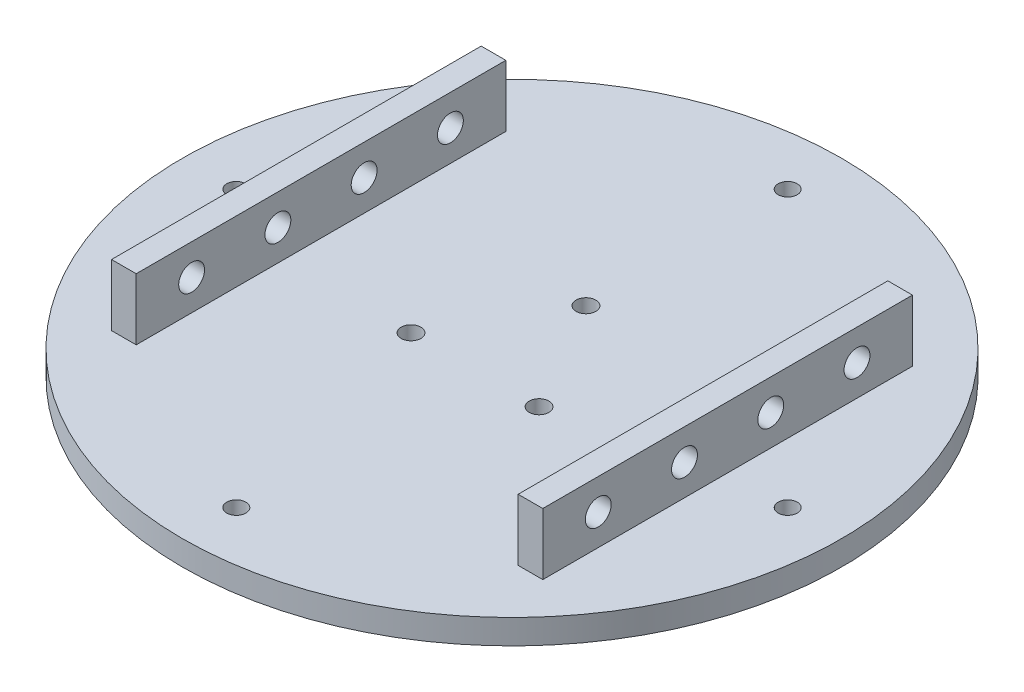
ISO-10303-21;
HEADER;
FILE_DESCRIPTION(('STEP AP214'),'2;1');
FILE_NAME('part.step','',(''),(''),'','','');
FILE_SCHEMA(('AUTOMOTIVE_DESIGN { 1 0 10303 214 1 1 1 1 }'));
ENDSEC;
DATA;
#1=APPLICATION_CONTEXT('core data for automotive mechanical design processes');
#2=APPLICATION_PROTOCOL_DEFINITION('international standard','automotive_design',2000,#1);
#3=PRODUCT_CONTEXT('',#1,'mechanical');
#4=PRODUCT('Part','Part','',(#3));
#5=PRODUCT_RELATED_PRODUCT_CATEGORY('part','',(#4));
#6=PRODUCT_DEFINITION_FORMATION('','',#4);
#7=PRODUCT_DEFINITION_CONTEXT('part definition',#1,'design');
#8=PRODUCT_DEFINITION('design','',#6,#7);
#9=PRODUCT_DEFINITION_SHAPE('','',#8);
#10=(LENGTH_UNIT() NAMED_UNIT(*) SI_UNIT(.MILLI.,.METRE.));
#11=(NAMED_UNIT(*) PLANE_ANGLE_UNIT() SI_UNIT($,.RADIAN.));
#12=(NAMED_UNIT(*) SI_UNIT($,.STERADIAN.) SOLID_ANGLE_UNIT());
#13=UNCERTAINTY_MEASURE_WITH_UNIT(LENGTH_MEASURE(1.E-05),#10,'distance_accuracy_value','');
#14=(GEOMETRIC_REPRESENTATION_CONTEXT(3) GLOBAL_UNCERTAINTY_ASSIGNED_CONTEXT((#13)) GLOBAL_UNIT_ASSIGNED_CONTEXT((#10,
#11,#12)) REPRESENTATION_CONTEXT('',''));
#15=CARTESIAN_POINT('',(0.,0.,0.));
#16=DIRECTION('',(0.,0.,1.));
#17=DIRECTION('',(1.,0.,0.));
#18=AXIS2_PLACEMENT_3D('',#15,#16,#17);
#19=CARTESIAN_POINT('',(0.,4.,0.));
#20=DIRECTION('',(0.,1.,0.));
#21=DIRECTION('',(0.,0.,1.));
#22=AXIS2_PLACEMENT_3D('',#19,#20,#21);
#23=PLANE('',#22);
#24=CARTESIAN_POINT('',(10.3923048454133,4.,5.99999999999997));
#25=DIRECTION('',(0.,1.,0.));
#26=DIRECTION('',(0.,0.,1.));
#27=AXIS2_PLACEMENT_3D('',#24,#25,#26);
#28=CIRCLE('',#27,1.6);
#29=CARTESIAN_POINT('',(10.3923048454133,4.,7.59999999999998));
#30=VERTEX_POINT('',#29);
#31=EDGE_CURVE('E166',#30,#30,#28,.T.);
#32=ORIENTED_EDGE('',*,*,#31,.F.);
#33=EDGE_LOOP('',(#32));
#34=FACE_BOUND('',#33,.T.);
#35=CARTESIAN_POINT('',(0.,4.,44.75));
#36=DIRECTION('',(0.,1.,0.));
#37=DIRECTION('',(0.,0.,-1.));
#38=AXIS2_PLACEMENT_3D('',#35,#36,#37);
#39=CIRCLE('',#38,1.55);
#40=CARTESIAN_POINT('',(0.,4.,43.2));
#41=VERTEX_POINT('',#40);
#42=EDGE_CURVE('E178',#41,#41,#39,.T.);
#43=ORIENTED_EDGE('',*,*,#42,.F.);
#44=EDGE_LOOP('',(#43));
#45=FACE_BOUND('',#44,.T.);
#46=CARTESIAN_POINT('',(-44.75,4.,0.));
#47=DIRECTION('',(0.,1.,0.));
#48=DIRECTION('',(0.,0.,1.));
#49=AXIS2_PLACEMENT_3D('',#46,#47,#48);
#50=CIRCLE('',#49,1.55);
#51=CARTESIAN_POINT('',(-44.75,4.,1.55));
#52=VERTEX_POINT('',#51);
#53=EDGE_CURVE('E190',#52,#52,#50,.T.);
#54=ORIENTED_EDGE('',*,*,#53,.F.);
#55=EDGE_LOOP('',(#54));
#56=FACE_BOUND('',#55,.T.);
#57=CARTESIAN_POINT('',(0.,4.,0.));
#58=DIRECTION('',(0.,1.,0.));
#59=DIRECTION('',(0.,0.,1.));
#60=AXIS2_PLACEMENT_3D('',#57,#58,#59);
#61=CIRCLE('',#60,53.4919308927614);
#62=CARTESIAN_POINT('',(0.,4.,53.4919308927614));
#63=VERTEX_POINT('',#62);
#64=EDGE_CURVE('E11',#63,#63,#61,.T.);
#65=ORIENTED_EDGE('',*,*,#64,.T.);
#66=EDGE_LOOP('',(#65));
#67=FACE_BOUND('',#66,.T.);
#68=CARTESIAN_POINT('',(0.,4.,-44.75));
#69=DIRECTION('',(0.,1.,0.));
#70=DIRECTION('',(0.,0.,1.));
#71=AXIS2_PLACEMENT_3D('',#68,#69,#70);
#72=CIRCLE('',#71,1.55);
#73=CARTESIAN_POINT('',(0.,4.,-43.2));
#74=VERTEX_POINT('',#73);
#75=EDGE_CURVE('E196',#74,#74,#72,.T.);
#76=ORIENTED_EDGE('',*,*,#75,.F.);
#77=EDGE_LOOP('',(#76));
#78=FACE_BOUND('',#77,.T.);
#79=CARTESIAN_POINT('',(44.75,4.,0.));
#80=DIRECTION('',(0.,1.,0.));
#81=DIRECTION('',(0.,0.,-1.));
#82=AXIS2_PLACEMENT_3D('',#79,#80,#81);
#83=CIRCLE('',#82,1.55);
#84=CARTESIAN_POINT('',(44.75,4.,-1.55));
#85=VERTEX_POINT('',#84);
#86=EDGE_CURVE('E184',#85,#85,#83,.T.);
#87=ORIENTED_EDGE('',*,*,#86,.F.);
#88=EDGE_LOOP('',(#87));
#89=FACE_BOUND('',#88,.T.);
#90=CARTESIAN_POINT('',(0.,4.,-12.));
#91=DIRECTION('',(0.,1.,0.));
#92=DIRECTION('',(0.,0.,1.));
#93=AXIS2_PLACEMENT_3D('',#90,#91,#92);
#94=CIRCLE('',#93,1.6);
#95=CARTESIAN_POINT('',(0.,4.,-10.4));
#96=VERTEX_POINT('',#95);
#97=EDGE_CURVE('E172',#96,#96,#94,.T.);
#98=ORIENTED_EDGE('',*,*,#97,.F.);
#99=EDGE_LOOP('',(#98));
#100=FACE_BOUND('',#99,.T.);
#101=CARTESIAN_POINT('',(-10.3923048454133,4.,5.99999999999998));
#102=DIRECTION('',(0.,1.,0.));
#103=DIRECTION('',(0.,0.,1.));
#104=AXIS2_PLACEMENT_3D('',#101,#102,#103);
#105=CIRCLE('',#104,1.6);
#106=CARTESIAN_POINT('',(-10.3923048454133,4.,7.59999999999998));
#107=VERTEX_POINT('',#106);
#108=EDGE_CURVE('E160',#107,#107,#105,.T.);
#109=ORIENTED_EDGE('',*,*,#108,.F.);
#110=EDGE_LOOP('',(#109));
#111=FACE_BOUND('',#110,.T.);
#112=DIRECTION('',(1.,0.,0.));
#113=VECTOR('',#112,1.);
#114=CARTESIAN_POINT('',(-35.,4.,30.));
#115=LINE('',#114,#113);
#116=CARTESIAN_POINT('',(-35.,4.,30.));
#117=VERTEX_POINT('',#116);
#118=CARTESIAN_POINT('',(-31.,4.,30.));
#119=VERTEX_POINT('',#118);
#120=EDGE_CURVE('E131',#117,#119,#115,.T.);
#121=ORIENTED_EDGE('',*,*,#120,.F.);
#122=DIRECTION('',(0.,0.,1.));
#123=VECTOR('',#122,1.);
#124=CARTESIAN_POINT('',(-35.,4.,-30.));
#125=LINE('',#124,#123);
#126=CARTESIAN_POINT('',(-35.,4.,-30.));
#127=VERTEX_POINT('',#126);
#128=EDGE_CURVE('E128',#127,#117,#125,.T.);
#129=ORIENTED_EDGE('',*,*,#128,.F.);
#130=DIRECTION('',(-1.,0.,0.));
#131=VECTOR('',#130,1.);
#132=CARTESIAN_POINT('',(-35.,4.,-30.));
#133=LINE('',#132,#131);
#134=CARTESIAN_POINT('',(-31.,4.,-30.));
#135=VERTEX_POINT('',#134);
#136=EDGE_CURVE('E140',#135,#127,#133,.T.);
#137=ORIENTED_EDGE('',*,*,#136,.F.);
#138=DIRECTION('',(0.,0.,-1.));
#139=VECTOR('',#138,1.);
#140=CARTESIAN_POINT('',(-31.,4.,-30.));
#141=LINE('',#140,#139);
#142=EDGE_CURVE('E148',#119,#135,#141,.T.);
#143=ORIENTED_EDGE('',*,*,#142,.F.);
#144=EDGE_LOOP('',(#121,#129,#137,#143));
#145=FACE_BOUND('',#144,.T.);
#146=DIRECTION('',(-1.,0.,0.));
#147=VECTOR('',#146,1.);
#148=CARTESIAN_POINT('',(35.,4.,-30.));
#149=LINE('',#148,#147);
#150=CARTESIAN_POINT('',(35.,4.,-30.));
#151=VERTEX_POINT('',#150);
#152=CARTESIAN_POINT('',(31.,4.,-30.));
#153=VERTEX_POINT('',#152);
#154=EDGE_CURVE('E248',#151,#153,#149,.T.);
#155=ORIENTED_EDGE('',*,*,#154,.F.);
#156=DIRECTION('',(0.,0.,-1.));
#157=VECTOR('',#156,1.);
#158=CARTESIAN_POINT('',(35.,4.,-30.));
#159=LINE('',#158,#157);
#160=CARTESIAN_POINT('',(35.,4.,30.));
#161=VERTEX_POINT('',#160);
#162=EDGE_CURVE('E126',#161,#151,#159,.T.);
#163=ORIENTED_EDGE('',*,*,#162,.F.);
#164=DIRECTION('',(1.,0.,0.));
#165=VECTOR('',#164,1.);
#166=CARTESIAN_POINT('',(35.,4.,30.));
#167=LINE('',#166,#165);
#168=CARTESIAN_POINT('',(31.,4.,30.));
#169=VERTEX_POINT('',#168);
#170=EDGE_CURVE('E122',#169,#161,#167,.T.);
#171=ORIENTED_EDGE('',*,*,#170,.F.);
#172=DIRECTION('',(0.,0.,1.));
#173=VECTOR('',#172,1.);
#174=CARTESIAN_POINT('',(31.,4.,-30.));
#175=LINE('',#174,#173);
#176=EDGE_CURVE('E250',#153,#169,#175,.T.);
#177=ORIENTED_EDGE('',*,*,#176,.F.);
#178=EDGE_LOOP('',(#155,#163,#171,#177));
#179=FACE_BOUND('',#178,.T.);
#180=ADVANCED_FACE('F35',(#34,#45,#56,#67,#78,#89,#100,#111,#145,#179),#23,.T.);
#181=CARTESIAN_POINT('',(0.,0.,0.));
#182=DIRECTION('',(0.,1.,0.));
#183=DIRECTION('',(0.,0.,1.));
#184=AXIS2_PLACEMENT_3D('',#181,#182,#183);
#185=PLANE('',#184);
#186=CARTESIAN_POINT('',(0.,0.,0.));
#187=DIRECTION('',(0.,1.,0.));
#188=DIRECTION('',(0.,0.,1.));
#189=AXIS2_PLACEMENT_3D('',#186,#187,#188);
#190=CIRCLE('',#189,53.4919308927614);
#191=CARTESIAN_POINT('',(0.,0.,53.4919308927614));
#192=VERTEX_POINT('',#191);
#193=EDGE_CURVE('E44',#192,#192,#190,.T.);
#194=ORIENTED_EDGE('',*,*,#193,.F.);
#195=EDGE_LOOP('',(#194));
#196=FACE_BOUND('',#195,.T.);
#197=CARTESIAN_POINT('',(0.,0.,-44.75));
#198=DIRECTION('',(0.,1.,0.));
#199=DIRECTION('',(0.,0.,1.));
#200=AXIS2_PLACEMENT_3D('',#197,#198,#199);
#201=CIRCLE('',#200,1.55);
#202=CARTESIAN_POINT('',(0.,0.,-43.2));
#203=VERTEX_POINT('',#202);
#204=EDGE_CURVE('E193',#203,#203,#201,.T.);
#205=ORIENTED_EDGE('',*,*,#204,.T.);
#206=EDGE_LOOP('',(#205));
#207=FACE_BOUND('',#206,.T.);
#208=CARTESIAN_POINT('',(-44.75,0.,0.));
#209=DIRECTION('',(0.,1.,0.));
#210=DIRECTION('',(0.,0.,1.));
#211=AXIS2_PLACEMENT_3D('',#208,#209,#210);
#212=CIRCLE('',#211,1.55);
#213=CARTESIAN_POINT('',(-44.75,0.,1.55));
#214=VERTEX_POINT('',#213);
#215=EDGE_CURVE('E187',#214,#214,#212,.T.);
#216=ORIENTED_EDGE('',*,*,#215,.T.);
#217=EDGE_LOOP('',(#216));
#218=FACE_BOUND('',#217,.T.);
#219=CARTESIAN_POINT('',(44.75,0.,0.));
#220=DIRECTION('',(0.,1.,0.));
#221=DIRECTION('',(0.,0.,-1.));
#222=AXIS2_PLACEMENT_3D('',#219,#220,#221);
#223=CIRCLE('',#222,1.55);
#224=CARTESIAN_POINT('',(44.75,0.,-1.55));
#225=VERTEX_POINT('',#224);
#226=EDGE_CURVE('E181',#225,#225,#223,.T.);
#227=ORIENTED_EDGE('',*,*,#226,.T.);
#228=EDGE_LOOP('',(#227));
#229=FACE_BOUND('',#228,.T.);
#230=CARTESIAN_POINT('',(0.,0.,44.75));
#231=DIRECTION('',(0.,1.,0.));
#232=DIRECTION('',(0.,0.,-1.));
#233=AXIS2_PLACEMENT_3D('',#230,#231,#232);
#234=CIRCLE('',#233,1.55);
#235=CARTESIAN_POINT('',(0.,0.,43.2));
#236=VERTEX_POINT('',#235);
#237=EDGE_CURVE('E175',#236,#236,#234,.T.);
#238=ORIENTED_EDGE('',*,*,#237,.T.);
#239=EDGE_LOOP('',(#238));
#240=FACE_BOUND('',#239,.T.);
#241=CARTESIAN_POINT('',(0.,0.,-12.));
#242=DIRECTION('',(0.,1.,0.));
#243=DIRECTION('',(0.,0.,1.));
#244=AXIS2_PLACEMENT_3D('',#241,#242,#243);
#245=CIRCLE('',#244,1.6);
#246=CARTESIAN_POINT('',(0.,0.,-10.4));
#247=VERTEX_POINT('',#246);
#248=EDGE_CURVE('E169',#247,#247,#245,.T.);
#249=ORIENTED_EDGE('',*,*,#248,.T.);
#250=EDGE_LOOP('',(#249));
#251=FACE_BOUND('',#250,.T.);
#252=CARTESIAN_POINT('',(10.3923048454133,0.,5.99999999999997));
#253=DIRECTION('',(0.,1.,0.));
#254=DIRECTION('',(0.,0.,1.));
#255=AXIS2_PLACEMENT_3D('',#252,#253,#254);
#256=CIRCLE('',#255,1.6);
#257=CARTESIAN_POINT('',(10.3923048454133,0.,7.59999999999998));
#258=VERTEX_POINT('',#257);
#259=EDGE_CURVE('E163',#258,#258,#256,.T.);
#260=ORIENTED_EDGE('',*,*,#259,.T.);
#261=EDGE_LOOP('',(#260));
#262=FACE_BOUND('',#261,.T.);
#263=CARTESIAN_POINT('',(-10.3923048454133,0.,5.99999999999998));
#264=DIRECTION('',(0.,1.,0.));
#265=DIRECTION('',(0.,0.,1.));
#266=AXIS2_PLACEMENT_3D('',#263,#264,#265);
#267=CIRCLE('',#266,1.6);
#268=CARTESIAN_POINT('',(-10.3923048454133,0.,7.59999999999998));
#269=VERTEX_POINT('',#268);
#270=EDGE_CURVE('E159',#269,#269,#267,.T.);
#271=ORIENTED_EDGE('',*,*,#270,.T.);
#272=EDGE_LOOP('',(#271));
#273=FACE_BOUND('',#272,.T.);
#274=ADVANCED_FACE('F270',(#196,#207,#218,#229,#240,#251,#262,#273),#185,.F.);
#275=CARTESIAN_POINT('',(0.,4.,0.));
#276=DIRECTION('',(0.,-1.,0.));
#277=DIRECTION('',(0.,0.,-1.));
#278=AXIS2_PLACEMENT_3D('',#275,#276,#277);
#279=CYLINDRICAL_SURFACE('',#278,53.4919308927614);
#280=ORIENTED_EDGE('',*,*,#64,.F.);
#281=EDGE_LOOP('',(#280));
#282=FACE_BOUND('',#281,.T.);
#283=ORIENTED_EDGE('',*,*,#193,.T.);
#284=EDGE_LOOP('',(#283));
#285=FACE_BOUND('',#284,.T.);
#286=ADVANCED_FACE('F37',(#282,#285),#279,.T.);
#287=CARTESIAN_POINT('',(0.,4.,-44.75));
#288=DIRECTION('',(0.,-1.,0.));
#289=DIRECTION('',(0.,0.,-1.));
#290=AXIS2_PLACEMENT_3D('',#287,#288,#289);
#291=CYLINDRICAL_SURFACE('',#290,1.55);
#292=ORIENTED_EDGE('',*,*,#75,.T.);
#293=EDGE_LOOP('',(#292));
#294=FACE_BOUND('',#293,.T.);
#295=ORIENTED_EDGE('',*,*,#204,.F.);
#296=EDGE_LOOP('',(#295));
#297=FACE_BOUND('',#296,.T.);
#298=ADVANCED_FACE('F280',(#294,#297),#291,.F.);
#299=CARTESIAN_POINT('',(-44.75,4.,0.));
#300=DIRECTION('',(0.,-1.,0.));
#301=DIRECTION('',(0.,0.,-1.));
#302=AXIS2_PLACEMENT_3D('',#299,#300,#301);
#303=CYLINDRICAL_SURFACE('',#302,1.55);
#304=ORIENTED_EDGE('',*,*,#53,.T.);
#305=EDGE_LOOP('',(#304));
#306=FACE_BOUND('',#305,.T.);
#307=ORIENTED_EDGE('',*,*,#215,.F.);
#308=EDGE_LOOP('',(#307));
#309=FACE_BOUND('',#308,.T.);
#310=ADVANCED_FACE('F283',(#306,#309),#303,.F.);
#311=CARTESIAN_POINT('',(44.75,4.,0.));
#312=DIRECTION('',(0.,-1.,0.));
#313=DIRECTION('',(0.,0.,-1.));
#314=AXIS2_PLACEMENT_3D('',#311,#312,#313);
#315=CYLINDRICAL_SURFACE('',#314,1.55);
#316=ORIENTED_EDGE('',*,*,#86,.T.);
#317=EDGE_LOOP('',(#316));
#318=FACE_BOUND('',#317,.T.);
#319=ORIENTED_EDGE('',*,*,#226,.F.);
#320=EDGE_LOOP('',(#319));
#321=FACE_BOUND('',#320,.T.);
#322=ADVANCED_FACE('F287',(#318,#321),#315,.F.);
#323=CARTESIAN_POINT('',(0.,4.,44.75));
#324=DIRECTION('',(0.,-1.,0.));
#325=DIRECTION('',(0.,0.,-1.));
#326=AXIS2_PLACEMENT_3D('',#323,#324,#325);
#327=CYLINDRICAL_SURFACE('',#326,1.55);
#328=ORIENTED_EDGE('',*,*,#42,.T.);
#329=EDGE_LOOP('',(#328));
#330=FACE_BOUND('',#329,.T.);
#331=ORIENTED_EDGE('',*,*,#237,.F.);
#332=EDGE_LOOP('',(#331));
#333=FACE_BOUND('',#332,.T.);
#334=ADVANCED_FACE('F291',(#330,#333),#327,.F.);
#335=CARTESIAN_POINT('',(0.,4.,-12.));
#336=DIRECTION('',(0.,-1.,0.));
#337=DIRECTION('',(0.,0.,-1.));
#338=AXIS2_PLACEMENT_3D('',#335,#336,#337);
#339=CYLINDRICAL_SURFACE('',#338,1.6);
#340=ORIENTED_EDGE('',*,*,#97,.T.);
#341=EDGE_LOOP('',(#340));
#342=FACE_BOUND('',#341,.T.);
#343=ORIENTED_EDGE('',*,*,#248,.F.);
#344=EDGE_LOOP('',(#343));
#345=FACE_BOUND('',#344,.T.);
#346=ADVANCED_FACE('F295',(#342,#345),#339,.F.);
#347=CARTESIAN_POINT('',(10.3923048454133,4.,5.99999999999997));
#348=DIRECTION('',(0.,-1.,0.));
#349=DIRECTION('',(0.,0.,-1.));
#350=AXIS2_PLACEMENT_3D('',#347,#348,#349);
#351=CYLINDRICAL_SURFACE('',#350,1.6);
#352=ORIENTED_EDGE('',*,*,#31,.T.);
#353=EDGE_LOOP('',(#352));
#354=FACE_BOUND('',#353,.T.);
#355=ORIENTED_EDGE('',*,*,#259,.F.);
#356=EDGE_LOOP('',(#355));
#357=FACE_BOUND('',#356,.T.);
#358=ADVANCED_FACE('F299',(#354,#357),#351,.F.);
#359=CARTESIAN_POINT('',(-10.3923048454133,4.,5.99999999999998));
#360=DIRECTION('',(0.,-1.,0.));
#361=DIRECTION('',(0.,0.,-1.));
#362=AXIS2_PLACEMENT_3D('',#359,#360,#361);
#363=CYLINDRICAL_SURFACE('',#362,1.6);
#364=ORIENTED_EDGE('',*,*,#108,.T.);
#365=EDGE_LOOP('',(#364));
#366=FACE_BOUND('',#365,.T.);
#367=ORIENTED_EDGE('',*,*,#270,.F.);
#368=EDGE_LOOP('',(#367));
#369=FACE_BOUND('',#368,.T.);
#370=ADVANCED_FACE('F303',(#366,#369),#363,.F.);
#371=CARTESIAN_POINT('',(-35.,14.,-30.));
#372=DIRECTION('',(1.,0.,0.));
#373=DIRECTION('',(0.,0.,-1.));
#374=AXIS2_PLACEMENT_3D('',#371,#372,#373);
#375=PLANE('',#374);
#376=CARTESIAN_POINT('',(-35.,9.,21.));
#377=DIRECTION('',(-1.,0.,0.));
#378=DIRECTION('',(0.,0.,-1.));
#379=AXIS2_PLACEMENT_3D('',#376,#377,#378);
#380=CIRCLE('',#379,2.1);
#381=CARTESIAN_POINT('',(-35.,9.,18.9));
#382=VERTEX_POINT('',#381);
#383=EDGE_CURVE('E427',#382,#382,#380,.T.);
#384=ORIENTED_EDGE('',*,*,#383,.F.);
#385=EDGE_LOOP('',(#384));
#386=FACE_BOUND('',#385,.T.);
#387=CARTESIAN_POINT('',(-35.,9.,-21.));
#388=DIRECTION('',(-1.,0.,0.));
#389=DIRECTION('',(0.,0.,1.));
#390=AXIS2_PLACEMENT_3D('',#387,#388,#389);
#391=CIRCLE('',#390,2.1);
#392=CARTESIAN_POINT('',(-35.,9.,-18.9));
#393=VERTEX_POINT('',#392);
#394=EDGE_CURVE('E447',#393,#393,#391,.T.);
#395=ORIENTED_EDGE('',*,*,#394,.F.);
#396=EDGE_LOOP('',(#395));
#397=FACE_BOUND('',#396,.T.);
#398=CARTESIAN_POINT('',(-35.,9.,-7.));
#399=DIRECTION('',(-1.,0.,0.));
#400=DIRECTION('',(0.,0.,1.));
#401=AXIS2_PLACEMENT_3D('',#398,#399,#400);
#402=CIRCLE('',#401,2.1);
#403=CARTESIAN_POINT('',(-35.,9.,-4.9));
#404=VERTEX_POINT('',#403);
#405=EDGE_CURVE('E211',#404,#404,#402,.T.);
#406=ORIENTED_EDGE('',*,*,#405,.F.);
#407=EDGE_LOOP('',(#406));
#408=FACE_BOUND('',#407,.T.);
#409=CARTESIAN_POINT('',(-35.,9.,7.));
#410=DIRECTION('',(-1.,0.,0.));
#411=DIRECTION('',(0.,0.,-1.));
#412=AXIS2_PLACEMENT_3D('',#409,#410,#411);
#413=CIRCLE('',#412,2.1);
#414=CARTESIAN_POINT('',(-35.,9.,4.9));
#415=VERTEX_POINT('',#414);
#416=EDGE_CURVE('E207',#415,#415,#413,.T.);
#417=ORIENTED_EDGE('',*,*,#416,.F.);
#418=EDGE_LOOP('',(#417));
#419=FACE_BOUND('',#418,.T.);
#420=ORIENTED_EDGE('',*,*,#128,.T.);
#421=DIRECTION('',(0.,-1.,0.));
#422=VECTOR('',#421,1.);
#423=CARTESIAN_POINT('',(-35.,14.,30.));
#424=LINE('',#423,#422);
#425=CARTESIAN_POINT('',(-35.,14.,30.));
#426=VERTEX_POINT('',#425);
#427=EDGE_CURVE('E157',#426,#117,#424,.T.);
#428=ORIENTED_EDGE('',*,*,#427,.F.);
#429=DIRECTION('',(0.,0.,1.));
#430=VECTOR('',#429,1.);
#431=CARTESIAN_POINT('',(-35.,14.,-30.));
#432=LINE('',#431,#430);
#433=CARTESIAN_POINT('',(-35.,14.,-30.));
#434=VERTEX_POINT('',#433);
#435=EDGE_CURVE('E136',#434,#426,#432,.T.);
#436=ORIENTED_EDGE('',*,*,#435,.F.);
#437=DIRECTION('',(0.,-1.,0.));
#438=VECTOR('',#437,1.);
#439=CARTESIAN_POINT('',(-35.,14.,-30.));
#440=LINE('',#439,#438);
#441=EDGE_CURVE('E145',#434,#127,#440,.T.);
#442=ORIENTED_EDGE('',*,*,#441,.T.);
#443=EDGE_LOOP('',(#420,#428,#436,#442));
#444=FACE_BOUND('',#443,.T.);
#445=ADVANCED_FACE('F307',(#386,#397,#408,#419,#444),#375,.F.);
#446=CARTESIAN_POINT('',(-35.,14.,30.));
#447=DIRECTION('',(0.,0.,-1.));
#448=DIRECTION('',(-1.,0.,0.));
#449=AXIS2_PLACEMENT_3D('',#446,#447,#448);
#450=PLANE('',#449);
#451=ORIENTED_EDGE('',*,*,#120,.T.);
#452=DIRECTION('',(0.,-1.,0.));
#453=VECTOR('',#452,1.);
#454=CARTESIAN_POINT('',(-31.,14.,30.));
#455=LINE('',#454,#453);
#456=CARTESIAN_POINT('',(-31.,14.,30.));
#457=VERTEX_POINT('',#456);
#458=EDGE_CURVE('E154',#457,#119,#455,.T.);
#459=ORIENTED_EDGE('',*,*,#458,.F.);
#460=DIRECTION('',(1.,0.,0.));
#461=VECTOR('',#460,1.);
#462=CARTESIAN_POINT('',(-35.,14.,30.));
#463=LINE('',#462,#461);
#464=EDGE_CURVE('E139',#426,#457,#463,.T.);
#465=ORIENTED_EDGE('',*,*,#464,.F.);
#466=ORIENTED_EDGE('',*,*,#427,.T.);
#467=EDGE_LOOP('',(#451,#459,#465,#466));
#468=FACE_BOUND('',#467,.T.);
#469=ADVANCED_FACE('F311',(#468),#450,.F.);
#470=CARTESIAN_POINT('',(-31.,14.,-30.));
#471=DIRECTION('',(-1.,0.,0.));
#472=DIRECTION('',(0.,0.,1.));
#473=AXIS2_PLACEMENT_3D('',#470,#471,#472);
#474=PLANE('',#473);
#475=CARTESIAN_POINT('',(-31.,9.,21.));
#476=DIRECTION('',(-1.,0.,0.));
#477=DIRECTION('',(0.,0.,1.));
#478=AXIS2_PLACEMENT_3D('',#475,#476,#477);
#479=CIRCLE('',#478,2.1);
#480=CARTESIAN_POINT('',(-31.,9.,23.1));
#481=VERTEX_POINT('',#480);
#482=EDGE_CURVE('E234',#481,#481,#479,.T.);
#483=ORIENTED_EDGE('',*,*,#482,.T.);
#484=EDGE_LOOP('',(#483));
#485=FACE_BOUND('',#484,.T.);
#486=CARTESIAN_POINT('',(-31.,9.,-21.));
#487=DIRECTION('',(-1.,0.,0.));
#488=DIRECTION('',(0.,0.,1.));
#489=AXIS2_PLACEMENT_3D('',#486,#487,#488);
#490=CIRCLE('',#489,2.1);
#491=CARTESIAN_POINT('',(-31.,9.,-18.9));
#492=VERTEX_POINT('',#491);
#493=EDGE_CURVE('E219',#492,#492,#490,.T.);
#494=ORIENTED_EDGE('',*,*,#493,.T.);
#495=EDGE_LOOP('',(#494));
#496=FACE_BOUND('',#495,.T.);
#497=CARTESIAN_POINT('',(-31.,9.,-7.));
#498=DIRECTION('',(-1.,0.,0.));
#499=DIRECTION('',(0.,0.,1.));
#500=AXIS2_PLACEMENT_3D('',#497,#498,#499);
#501=CIRCLE('',#500,2.1);
#502=CARTESIAN_POINT('',(-31.,9.,-4.9));
#503=VERTEX_POINT('',#502);
#504=EDGE_CURVE('E215',#503,#503,#501,.T.);
#505=ORIENTED_EDGE('',*,*,#504,.T.);
#506=EDGE_LOOP('',(#505));
#507=FACE_BOUND('',#506,.T.);
#508=CARTESIAN_POINT('',(-31.,9.,7.));
#509=DIRECTION('',(-1.,0.,0.));
#510=DIRECTION('',(0.,0.,1.));
#511=AXIS2_PLACEMENT_3D('',#508,#509,#510);
#512=CIRCLE('',#511,2.1);
#513=CARTESIAN_POINT('',(-31.,9.,9.1));
#514=VERTEX_POINT('',#513);
#515=EDGE_CURVE('E241',#514,#514,#512,.T.);
#516=ORIENTED_EDGE('',*,*,#515,.T.);
#517=EDGE_LOOP('',(#516));
#518=FACE_BOUND('',#517,.T.);
#519=ORIENTED_EDGE('',*,*,#142,.T.);
#520=DIRECTION('',(0.,-1.,0.));
#521=VECTOR('',#520,1.);
#522=CARTESIAN_POINT('',(-31.,14.,-30.));
#523=LINE('',#522,#521);
#524=CARTESIAN_POINT('',(-31.,14.,-30.));
#525=VERTEX_POINT('',#524);
#526=EDGE_CURVE('E60',#525,#135,#523,.T.);
#527=ORIENTED_EDGE('',*,*,#526,.F.);
#528=DIRECTION('',(0.,0.,-1.));
#529=VECTOR('',#528,1.);
#530=CARTESIAN_POINT('',(-31.,14.,-30.));
#531=LINE('',#530,#529);
#532=EDGE_CURVE('E142',#457,#525,#531,.T.);
#533=ORIENTED_EDGE('',*,*,#532,.F.);
#534=ORIENTED_EDGE('',*,*,#458,.T.);
#535=EDGE_LOOP('',(#519,#527,#533,#534));
#536=FACE_BOUND('',#535,.T.);
#537=ADVANCED_FACE('F315',(#485,#496,#507,#518,#536),#474,.F.);
#538=CARTESIAN_POINT('',(-35.,14.,-30.));
#539=DIRECTION('',(0.,0.,1.));
#540=DIRECTION('',(1.,0.,0.));
#541=AXIS2_PLACEMENT_3D('',#538,#539,#540);
#542=PLANE('',#541);
#543=ORIENTED_EDGE('',*,*,#136,.T.);
#544=ORIENTED_EDGE('',*,*,#441,.F.);
#545=DIRECTION('',(-1.,0.,0.));
#546=VECTOR('',#545,1.);
#547=CARTESIAN_POINT('',(-35.,14.,-30.));
#548=LINE('',#547,#546);
#549=EDGE_CURVE('E144',#525,#434,#548,.T.);
#550=ORIENTED_EDGE('',*,*,#549,.F.);
#551=ORIENTED_EDGE('',*,*,#526,.T.);
#552=EDGE_LOOP('',(#543,#544,#550,#551));
#553=FACE_BOUND('',#552,.T.);
#554=ADVANCED_FACE('F319',(#553),#542,.F.);
#555=CARTESIAN_POINT('',(0.,14.,0.));
#556=DIRECTION('',(0.,1.,0.));
#557=DIRECTION('',(0.,0.,1.));
#558=AXIS2_PLACEMENT_3D('',#555,#556,#557);
#559=PLANE('',#558);
#560=ORIENTED_EDGE('',*,*,#435,.T.);
#561=ORIENTED_EDGE('',*,*,#464,.T.);
#562=ORIENTED_EDGE('',*,*,#532,.T.);
#563=ORIENTED_EDGE('',*,*,#549,.T.);
#564=EDGE_LOOP('',(#560,#561,#562,#563));
#565=FACE_BOUND('',#564,.T.);
#566=ADVANCED_FACE('F323',(#565),#559,.T.);
#567=CARTESIAN_POINT('',(35.,14.,-30.));
#568=DIRECTION('',(-1.,0.,0.));
#569=DIRECTION('',(0.,0.,1.));
#570=AXIS2_PLACEMENT_3D('',#567,#568,#569);
#571=PLANE('',#570);
#572=CARTESIAN_POINT('',(35.,9.,21.));
#573=DIRECTION('',(-1.,0.,0.));
#574=DIRECTION('',(0.,0.,1.));
#575=AXIS2_PLACEMENT_3D('',#572,#573,#574);
#576=CIRCLE('',#575,2.1);
#577=CARTESIAN_POINT('',(35.,9.,23.1));
#578=VERTEX_POINT('',#577);
#579=EDGE_CURVE('E231',#578,#578,#576,.T.);
#580=ORIENTED_EDGE('',*,*,#579,.T.);
#581=EDGE_LOOP('',(#580));
#582=FACE_BOUND('',#581,.T.);
#583=CARTESIAN_POINT('',(35.,9.,-21.));
#584=DIRECTION('',(-1.,0.,0.));
#585=DIRECTION('',(0.,0.,1.));
#586=AXIS2_PLACEMENT_3D('',#583,#584,#585);
#587=CIRCLE('',#586,2.1);
#588=CARTESIAN_POINT('',(35.,9.,-18.9));
#589=VERTEX_POINT('',#588);
#590=EDGE_CURVE('E214',#589,#589,#587,.T.);
#591=ORIENTED_EDGE('',*,*,#590,.T.);
#592=EDGE_LOOP('',(#591));
#593=FACE_BOUND('',#592,.T.);
#594=CARTESIAN_POINT('',(35.,9.,-7.));
#595=DIRECTION('',(-1.,0.,0.));
#596=DIRECTION('',(0.,0.,1.));
#597=AXIS2_PLACEMENT_3D('',#594,#595,#596);
#598=CIRCLE('',#597,2.1);
#599=CARTESIAN_POINT('',(35.,9.,-4.9));
#600=VERTEX_POINT('',#599);
#601=EDGE_CURVE('E210',#600,#600,#598,.T.);
#602=ORIENTED_EDGE('',*,*,#601,.T.);
#603=EDGE_LOOP('',(#602));
#604=FACE_BOUND('',#603,.T.);
#605=CARTESIAN_POINT('',(35.,9.,7.));
#606=DIRECTION('',(-1.,0.,0.));
#607=DIRECTION('',(0.,0.,1.));
#608=AXIS2_PLACEMENT_3D('',#605,#606,#607);
#609=CIRCLE('',#608,2.1);
#610=CARTESIAN_POINT('',(35.,9.,9.1));
#611=VERTEX_POINT('',#610);
#612=EDGE_CURVE('E206',#611,#611,#609,.T.);
#613=ORIENTED_EDGE('',*,*,#612,.T.);
#614=EDGE_LOOP('',(#613));
#615=FACE_BOUND('',#614,.T.);
#616=ORIENTED_EDGE('',*,*,#162,.T.);
#617=DIRECTION('',(0.,-1.,0.));
#618=VECTOR('',#617,1.);
#619=CARTESIAN_POINT('',(35.,14.,-30.));
#620=LINE('',#619,#618);
#621=CARTESIAN_POINT('',(35.,14.,-30.));
#622=VERTEX_POINT('',#621);
#623=EDGE_CURVE('E107',#622,#151,#620,.T.);
#624=ORIENTED_EDGE('',*,*,#623,.F.);
#625=DIRECTION('',(0.,0.,-1.));
#626=VECTOR('',#625,1.);
#627=CARTESIAN_POINT('',(35.,14.,-30.));
#628=LINE('',#627,#626);
#629=CARTESIAN_POINT('',(35.,14.,30.));
#630=VERTEX_POINT('',#629);
#631=EDGE_CURVE('E114',#630,#622,#628,.T.);
#632=ORIENTED_EDGE('',*,*,#631,.F.);
#633=DIRECTION('',(0.,-1.,0.));
#634=VECTOR('',#633,1.);
#635=CARTESIAN_POINT('',(35.,14.,30.));
#636=LINE('',#635,#634);
#637=EDGE_CURVE('E246',#630,#161,#636,.T.);
#638=ORIENTED_EDGE('',*,*,#637,.T.);
#639=EDGE_LOOP('',(#616,#624,#632,#638));
#640=FACE_BOUND('',#639,.T.);
#641=ADVANCED_FACE('F124',(#582,#593,#604,#615,#640),#571,.F.);
#642=CARTESIAN_POINT('',(35.,14.,-30.));
#643=DIRECTION('',(0.,0.,1.));
#644=DIRECTION('',(1.,0.,0.));
#645=AXIS2_PLACEMENT_3D('',#642,#643,#644);
#646=PLANE('',#645);
#647=ORIENTED_EDGE('',*,*,#154,.T.);
#648=DIRECTION('',(0.,-1.,0.));
#649=VECTOR('',#648,1.);
#650=CARTESIAN_POINT('',(31.,14.,-30.));
#651=LINE('',#650,#649);
#652=CARTESIAN_POINT('',(31.,14.,-30.));
#653=VERTEX_POINT('',#652);
#654=EDGE_CURVE('E110',#653,#153,#651,.T.);
#655=ORIENTED_EDGE('',*,*,#654,.F.);
#656=DIRECTION('',(-1.,0.,0.));
#657=VECTOR('',#656,1.);
#658=CARTESIAN_POINT('',(35.,14.,-30.));
#659=LINE('',#658,#657);
#660=EDGE_CURVE('E103',#622,#653,#659,.T.);
#661=ORIENTED_EDGE('',*,*,#660,.F.);
#662=ORIENTED_EDGE('',*,*,#623,.T.);
#663=EDGE_LOOP('',(#647,#655,#661,#662));
#664=FACE_BOUND('',#663,.T.);
#665=ADVANCED_FACE('F105',(#664),#646,.F.);
#666=CARTESIAN_POINT('',(31.,14.,-30.));
#667=DIRECTION('',(1.,0.,0.));
#668=DIRECTION('',(0.,0.,-1.));
#669=AXIS2_PLACEMENT_3D('',#666,#667,#668);
#670=PLANE('',#669);
#671=CARTESIAN_POINT('',(31.,9.,21.));
#672=DIRECTION('',(1.,0.,0.));
#673=DIRECTION('',(0.,0.,-1.));
#674=AXIS2_PLACEMENT_3D('',#671,#672,#673);
#675=CIRCLE('',#674,2.1);
#676=CARTESIAN_POINT('',(31.,9.,18.9));
#677=VERTEX_POINT('',#676);
#678=EDGE_CURVE('E39',#677,#677,#675,.T.);
#679=ORIENTED_EDGE('',*,*,#678,.T.);
#680=EDGE_LOOP('',(#679));
#681=FACE_BOUND('',#680,.T.);
#682=CARTESIAN_POINT('',(31.,9.,-21.));
#683=DIRECTION('',(1.,0.,0.));
#684=DIRECTION('',(0.,0.,-1.));
#685=AXIS2_PLACEMENT_3D('',#682,#683,#684);
#686=CIRCLE('',#685,2.1);
#687=CARTESIAN_POINT('',(31.,9.,-23.1));
#688=VERTEX_POINT('',#687);
#689=EDGE_CURVE('E212',#688,#688,#686,.T.);
#690=ORIENTED_EDGE('',*,*,#689,.T.);
#691=EDGE_LOOP('',(#690));
#692=FACE_BOUND('',#691,.T.);
#693=CARTESIAN_POINT('',(31.,9.,-7.));
#694=DIRECTION('',(1.,0.,0.));
#695=DIRECTION('',(0.,0.,-1.));
#696=AXIS2_PLACEMENT_3D('',#693,#694,#695);
#697=CIRCLE('',#696,2.1);
#698=CARTESIAN_POINT('',(31.,9.,-9.1));
#699=VERTEX_POINT('',#698);
#700=EDGE_CURVE('E208',#699,#699,#697,.T.);
#701=ORIENTED_EDGE('',*,*,#700,.T.);
#702=EDGE_LOOP('',(#701));
#703=FACE_BOUND('',#702,.T.);
#704=CARTESIAN_POINT('',(31.,9.,7.));
#705=DIRECTION('',(1.,0.,0.));
#706=DIRECTION('',(0.,0.,-1.));
#707=AXIS2_PLACEMENT_3D('',#704,#705,#706);
#708=CIRCLE('',#707,2.1);
#709=CARTESIAN_POINT('',(31.,9.,4.9));
#710=VERTEX_POINT('',#709);
#711=EDGE_CURVE('E203',#710,#710,#708,.T.);
#712=ORIENTED_EDGE('',*,*,#711,.T.);
#713=EDGE_LOOP('',(#712));
#714=FACE_BOUND('',#713,.T.);
#715=ORIENTED_EDGE('',*,*,#176,.T.);
#716=DIRECTION('',(0.,-1.,0.));
#717=VECTOR('',#716,1.);
#718=CARTESIAN_POINT('',(31.,14.,30.));
#719=LINE('',#718,#717);
#720=CARTESIAN_POINT('',(31.,14.,30.));
#721=VERTEX_POINT('',#720);
#722=EDGE_CURVE('E52',#721,#169,#719,.T.);
#723=ORIENTED_EDGE('',*,*,#722,.F.);
#724=DIRECTION('',(0.,0.,1.));
#725=VECTOR('',#724,1.);
#726=CARTESIAN_POINT('',(31.,14.,-30.));
#727=LINE('',#726,#725);
#728=EDGE_CURVE('E113',#653,#721,#727,.T.);
#729=ORIENTED_EDGE('',*,*,#728,.F.);
#730=ORIENTED_EDGE('',*,*,#654,.T.);
#731=EDGE_LOOP('',(#715,#723,#729,#730));
#732=FACE_BOUND('',#731,.T.);
#733=ADVANCED_FACE('F257',(#681,#692,#703,#714,#732),#670,.F.);
#734=CARTESIAN_POINT('',(35.,14.,30.));
#735=DIRECTION('',(0.,0.,-1.));
#736=DIRECTION('',(-1.,0.,0.));
#737=AXIS2_PLACEMENT_3D('',#734,#735,#736);
#738=PLANE('',#737);
#739=ORIENTED_EDGE('',*,*,#170,.T.);
#740=ORIENTED_EDGE('',*,*,#637,.F.);
#741=DIRECTION('',(1.,0.,0.));
#742=VECTOR('',#741,1.);
#743=CARTESIAN_POINT('',(35.,14.,30.));
#744=LINE('',#743,#742);
#745=EDGE_CURVE('E118',#721,#630,#744,.T.);
#746=ORIENTED_EDGE('',*,*,#745,.F.);
#747=ORIENTED_EDGE('',*,*,#722,.T.);
#748=EDGE_LOOP('',(#739,#740,#746,#747));
#749=FACE_BOUND('',#748,.T.);
#750=ADVANCED_FACE('F258',(#749),#738,.F.);
#751=CARTESIAN_POINT('',(0.,14.,0.));
#752=DIRECTION('',(0.,-1.,0.));
#753=DIRECTION('',(0.,0.,-1.));
#754=AXIS2_PLACEMENT_3D('',#751,#752,#753);
#755=PLANE('',#754);
#756=ORIENTED_EDGE('',*,*,#631,.T.);
#757=ORIENTED_EDGE('',*,*,#660,.T.);
#758=ORIENTED_EDGE('',*,*,#728,.T.);
#759=ORIENTED_EDGE('',*,*,#745,.T.);
#760=EDGE_LOOP('',(#756,#757,#758,#759));
#761=FACE_BOUND('',#760,.T.);
#762=ADVANCED_FACE('F117',(#761),#755,.F.);
#763=CARTESIAN_POINT('',(53.4919308927614,9.,7.));
#764=DIRECTION('',(-1.,0.,0.));
#765=DIRECTION('',(0.,0.,1.));
#766=AXIS2_PLACEMENT_3D('',#763,#764,#765);
#767=CYLINDRICAL_SURFACE('',#766,2.1);
#768=ORIENTED_EDGE('',*,*,#711,.F.);
#769=EDGE_LOOP('',(#768));
#770=FACE_BOUND('',#769,.T.);
#771=ORIENTED_EDGE('',*,*,#612,.F.);
#772=EDGE_LOOP('',(#771));
#773=FACE_BOUND('',#772,.T.);
#774=ADVANCED_FACE('F265',(#770,#773),#767,.F.);
#775=ORIENTED_EDGE('',*,*,#416,.T.);
#776=EDGE_LOOP('',(#775));
#777=FACE_BOUND('',#776,.T.);
#778=ORIENTED_EDGE('',*,*,#515,.F.);
#779=EDGE_LOOP('',(#778));
#780=FACE_BOUND('',#779,.T.);
#781=ADVANCED_FACE('F353',(#777,#780),#767,.F.);
#782=CARTESIAN_POINT('',(53.4919308927614,9.,-7.));
#783=DIRECTION('',(-1.,0.,0.));
#784=DIRECTION('',(0.,0.,1.));
#785=AXIS2_PLACEMENT_3D('',#782,#783,#784);
#786=CYLINDRICAL_SURFACE('',#785,2.1);
#787=ORIENTED_EDGE('',*,*,#700,.F.);
#788=EDGE_LOOP('',(#787));
#789=FACE_BOUND('',#788,.T.);
#790=ORIENTED_EDGE('',*,*,#601,.F.);
#791=EDGE_LOOP('',(#790));
#792=FACE_BOUND('',#791,.T.);
#793=ADVANCED_FACE('F364',(#789,#792),#786,.F.);
#794=CARTESIAN_POINT('',(53.4919308927614,9.,-21.));
#795=DIRECTION('',(-1.,0.,0.));
#796=DIRECTION('',(0.,0.,1.));
#797=AXIS2_PLACEMENT_3D('',#794,#795,#796);
#798=CYLINDRICAL_SURFACE('',#797,2.1);
#799=ORIENTED_EDGE('',*,*,#689,.F.);
#800=EDGE_LOOP('',(#799));
#801=FACE_BOUND('',#800,.T.);
#802=ORIENTED_EDGE('',*,*,#590,.F.);
#803=EDGE_LOOP('',(#802));
#804=FACE_BOUND('',#803,.T.);
#805=ADVANCED_FACE('F373',(#801,#804),#798,.F.);
#806=CARTESIAN_POINT('',(53.4919308927614,9.,21.));
#807=DIRECTION('',(-1.,0.,0.));
#808=DIRECTION('',(0.,0.,1.));
#809=AXIS2_PLACEMENT_3D('',#806,#807,#808);
#810=CYLINDRICAL_SURFACE('',#809,2.1);
#811=ORIENTED_EDGE('',*,*,#678,.F.);
#812=EDGE_LOOP('',(#811));
#813=FACE_BOUND('',#812,.T.);
#814=ORIENTED_EDGE('',*,*,#579,.F.);
#815=EDGE_LOOP('',(#814));
#816=FACE_BOUND('',#815,.T.);
#817=ADVANCED_FACE('F384',(#813,#816),#810,.F.);
#818=ORIENTED_EDGE('',*,*,#405,.T.);
#819=EDGE_LOOP('',(#818));
#820=FACE_BOUND('',#819,.T.);
#821=ORIENTED_EDGE('',*,*,#504,.F.);
#822=EDGE_LOOP('',(#821));
#823=FACE_BOUND('',#822,.T.);
#824=ADVANCED_FACE('F376',(#820,#823),#786,.F.);
#825=ORIENTED_EDGE('',*,*,#394,.T.);
#826=EDGE_LOOP('',(#825));
#827=FACE_BOUND('',#826,.T.);
#828=ORIENTED_EDGE('',*,*,#493,.F.);
#829=EDGE_LOOP('',(#828));
#830=FACE_BOUND('',#829,.T.);
#831=ADVANCED_FACE('F387',(#827,#830),#798,.F.);
#832=ORIENTED_EDGE('',*,*,#383,.T.);
#833=EDGE_LOOP('',(#832));
#834=FACE_BOUND('',#833,.T.);
#835=ORIENTED_EDGE('',*,*,#482,.F.);
#836=EDGE_LOOP('',(#835));
#837=FACE_BOUND('',#836,.T.);
#838=ADVANCED_FACE('F397',(#834,#837),#810,.F.);
#839=CLOSED_SHELL('',(#180,#274,#286,#298,#310,#322,#334,#346,#358,#370,#445,#469,#537,#554,
#566,#641,#665,#733,#750,#762,#774,#781,#793,#805,#817,#824,#831,#838));
#840=MANIFOLD_SOLID_BREP('B2',#839);
#841=ADVANCED_BREP_SHAPE_REPRESENTATION('',(#18,#840),#14);
#842=SHAPE_DEFINITION_REPRESENTATION(#9,#841);
ENDSEC;
END-ISO-10303-21;
